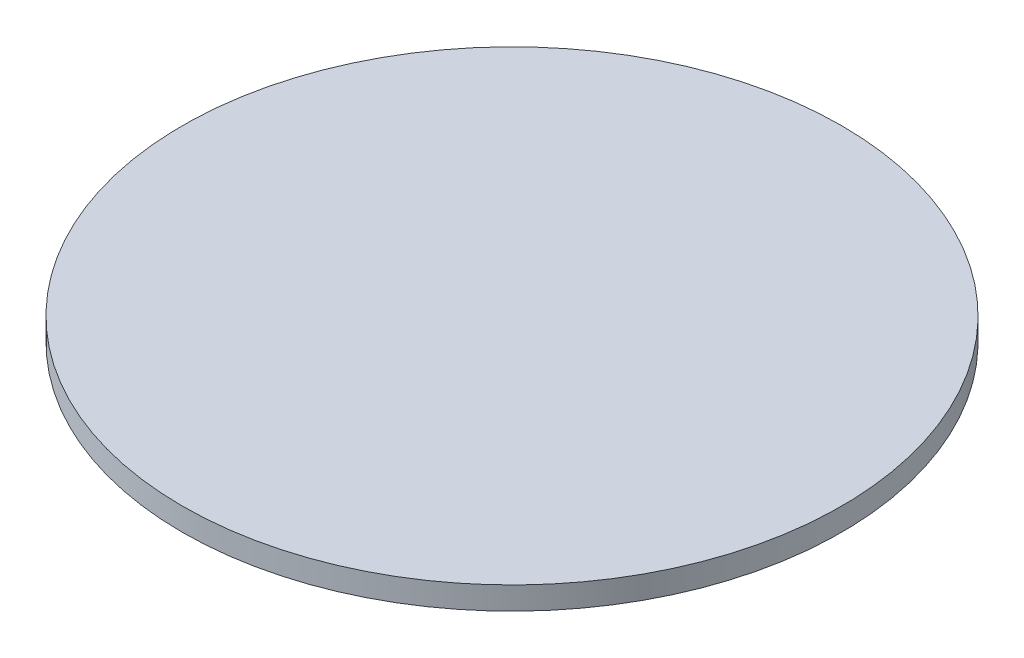
ISO-10303-21;
HEADER;
FILE_DESCRIPTION(('STEP AP214'),'2;1');
FILE_NAME('part.step','',(''),(''),'','','');
FILE_SCHEMA(('AUTOMOTIVE_DESIGN { 1 0 10303 214 1 1 1 1 }'));
ENDSEC;
DATA;
#1=APPLICATION_CONTEXT('core data for automotive mechanical design processes');
#2=APPLICATION_PROTOCOL_DEFINITION('international standard','automotive_design',2000,#1);
#3=PRODUCT_CONTEXT('',#1,'mechanical');
#4=PRODUCT('Part','Part','',(#3));
#5=PRODUCT_RELATED_PRODUCT_CATEGORY('part','',(#4));
#6=PRODUCT_DEFINITION_FORMATION('','',#4);
#7=PRODUCT_DEFINITION_CONTEXT('part definition',#1,'design');
#8=PRODUCT_DEFINITION('design','',#6,#7);
#9=PRODUCT_DEFINITION_SHAPE('','',#8);
#10=(LENGTH_UNIT() NAMED_UNIT(*) SI_UNIT(.MILLI.,.METRE.));
#11=(NAMED_UNIT(*) PLANE_ANGLE_UNIT() SI_UNIT($,.RADIAN.));
#12=(NAMED_UNIT(*) SI_UNIT($,.STERADIAN.) SOLID_ANGLE_UNIT());
#13=UNCERTAINTY_MEASURE_WITH_UNIT(LENGTH_MEASURE(1.E-05),#10,'distance_accuracy_value','');
#14=(GEOMETRIC_REPRESENTATION_CONTEXT(3) GLOBAL_UNCERTAINTY_ASSIGNED_CONTEXT((#13)) GLOBAL_UNIT_ASSIGNED_CONTEXT((#10,
#11,#12)) REPRESENTATION_CONTEXT('',''));
#15=CARTESIAN_POINT('',(0.,0.,0.));
#16=DIRECTION('',(0.,0.,1.));
#17=DIRECTION('',(1.,0.,0.));
#18=AXIS2_PLACEMENT_3D('',#15,#16,#17);
#19=CARTESIAN_POINT('',(0.,2.,0.));
#20=DIRECTION('',(0.,-1.,0.));
#21=DIRECTION('',(0.,0.,-1.));
#22=AXIS2_PLACEMENT_3D('',#19,#20,#21);
#23=CYLINDRICAL_SURFACE('',#22,29.);
#24=CARTESIAN_POINT('',(0.,2.,0.));
#25=DIRECTION('',(0.,1.,0.));
#26=DIRECTION('',(0.,0.,1.));
#27=AXIS2_PLACEMENT_3D('',#24,#25,#26);
#28=CIRCLE('',#27,29.);
#29=CARTESIAN_POINT('',(0.,2.,29.));
#30=VERTEX_POINT('',#29);
#31=EDGE_CURVE('E10',#30,#30,#28,.T.);
#32=ORIENTED_EDGE('',*,*,#31,.F.);
#33=EDGE_LOOP('',(#32));
#34=FACE_BOUND('',#33,.T.);
#35=CARTESIAN_POINT('',(0.,0.,0.));
#36=DIRECTION('',(0.,1.,0.));
#37=DIRECTION('',(0.,0.,1.));
#38=AXIS2_PLACEMENT_3D('',#35,#36,#37);
#39=CIRCLE('',#38,29.);
#40=CARTESIAN_POINT('',(0.,0.,29.));
#41=VERTEX_POINT('',#40);
#42=EDGE_CURVE('E34',#41,#41,#39,.T.);
#43=ORIENTED_EDGE('',*,*,#42,.T.);
#44=EDGE_LOOP('',(#43));
#45=FACE_BOUND('',#44,.T.);
#46=ADVANCED_FACE('F31',(#34,#45),#23,.T.);
#47=CARTESIAN_POINT('',(0.,2.,0.));
#48=DIRECTION('',(0.,1.,0.));
#49=DIRECTION('',(0.,0.,1.));
#50=AXIS2_PLACEMENT_3D('',#47,#48,#49);
#51=PLANE('',#50);
#52=ORIENTED_EDGE('',*,*,#31,.T.);
#53=EDGE_LOOP('',(#52));
#54=FACE_BOUND('',#53,.T.);
#55=ADVANCED_FACE('F46',(#54),#51,.T.);
#56=CARTESIAN_POINT('',(0.,0.,0.));
#57=DIRECTION('',(0.,1.,0.));
#58=DIRECTION('',(0.,0.,1.));
#59=AXIS2_PLACEMENT_3D('',#56,#57,#58);
#60=PLANE('',#59);
#61=ORIENTED_EDGE('',*,*,#42,.F.);
#62=EDGE_LOOP('',(#61));
#63=FACE_BOUND('',#62,.T.);
#64=ADVANCED_FACE('F44',(#63),#60,.F.);
#65=CLOSED_SHELL('',(#46,#55,#64));
#66=MANIFOLD_SOLID_BREP('B2',#65);
#67=ADVANCED_BREP_SHAPE_REPRESENTATION('',(#18,#66),#14);
#68=SHAPE_DEFINITION_REPRESENTATION(#9,#67);
ENDSEC;
END-ISO-10303-21;
